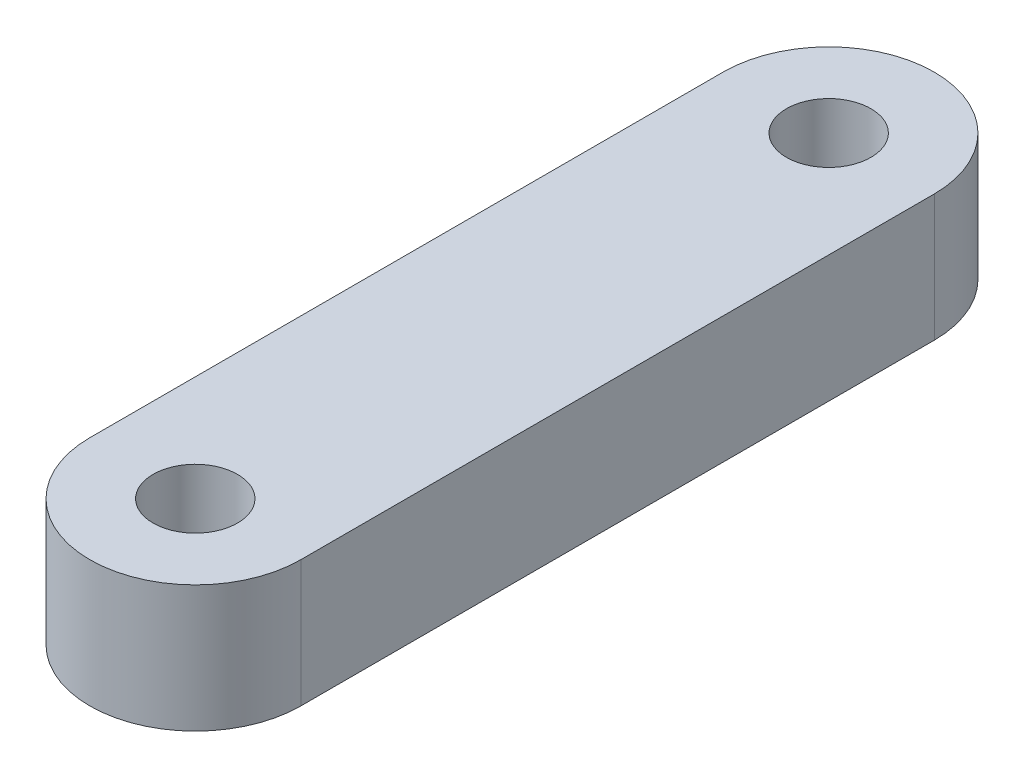
ISO-10303-21;
HEADER;
FILE_DESCRIPTION(('STEP AP214'),'2;1');
FILE_NAME('part.step','',(''),(''),'','','');
FILE_SCHEMA(('AUTOMOTIVE_DESIGN { 1 0 10303 214 1 1 1 1 }'));
ENDSEC;
DATA;
#1=APPLICATION_CONTEXT('core data for automotive mechanical design processes');
#2=APPLICATION_PROTOCOL_DEFINITION('international standard','automotive_design',2000,#1);
#3=PRODUCT_CONTEXT('',#1,'mechanical');
#4=PRODUCT('Part','Part','',(#3));
#5=PRODUCT_RELATED_PRODUCT_CATEGORY('part','',(#4));
#6=PRODUCT_DEFINITION_FORMATION('','',#4);
#7=PRODUCT_DEFINITION_CONTEXT('part definition',#1,'design');
#8=PRODUCT_DEFINITION('design','',#6,#7);
#9=PRODUCT_DEFINITION_SHAPE('','',#8);
#10=(LENGTH_UNIT() NAMED_UNIT(*) SI_UNIT(.MILLI.,.METRE.));
#11=(NAMED_UNIT(*) PLANE_ANGLE_UNIT() SI_UNIT($,.RADIAN.));
#12=(NAMED_UNIT(*) SI_UNIT($,.STERADIAN.) SOLID_ANGLE_UNIT());
#13=UNCERTAINTY_MEASURE_WITH_UNIT(LENGTH_MEASURE(1.E-05),#10,'distance_accuracy_value','');
#14=(GEOMETRIC_REPRESENTATION_CONTEXT(3) GLOBAL_UNCERTAINTY_ASSIGNED_CONTEXT((#13)) GLOBAL_UNIT_ASSIGNED_CONTEXT((#10,
#11,#12)) REPRESENTATION_CONTEXT('',''));
#15=CARTESIAN_POINT('',(0.,0.,0.));
#16=DIRECTION('',(0.,0.,1.));
#17=DIRECTION('',(1.,0.,0.));
#18=AXIS2_PLACEMENT_3D('',#15,#16,#17);
#19=CARTESIAN_POINT('',(0.,-3.,7.5));
#20=DIRECTION('',(0.,1.,0.));
#21=DIRECTION('',(0.,0.,1.));
#22=AXIS2_PLACEMENT_3D('',#19,#20,#21);
#23=CYLINDRICAL_SURFACE('',#22,2.5);
#24=CARTESIAN_POINT('',(0.,0.,7.5));
#25=DIRECTION('',(0.,1.,0.));
#26=DIRECTION('',(0.,0.,1.));
#27=AXIS2_PLACEMENT_3D('',#24,#25,#26);
#28=CIRCLE('',#27,2.5);
#29=CARTESIAN_POINT('',(-2.5,0.,7.5));
#30=VERTEX_POINT('',#29);
#31=CARTESIAN_POINT('',(2.5,0.,7.5));
#32=VERTEX_POINT('',#31);
#33=EDGE_CURVE('E102',#30,#32,#28,.T.);
#34=ORIENTED_EDGE('',*,*,#33,.F.);
#35=DIRECTION('',(0.,1.,0.));
#36=VECTOR('',#35,1.);
#37=CARTESIAN_POINT('',(-2.5,-3.,7.5));
#38=LINE('',#37,#36);
#39=CARTESIAN_POINT('',(-2.5,-3.,7.5));
#40=VERTEX_POINT('',#39);
#41=EDGE_CURVE('E11',#40,#30,#38,.T.);
#42=ORIENTED_EDGE('',*,*,#41,.F.);
#43=CARTESIAN_POINT('',(0.,-3.,7.5));
#44=DIRECTION('',(0.,1.,0.));
#45=DIRECTION('',(0.,0.,1.));
#46=AXIS2_PLACEMENT_3D('',#43,#44,#45);
#47=CIRCLE('',#46,2.5);
#48=CARTESIAN_POINT('',(2.5,-3.,7.5));
#49=VERTEX_POINT('',#48);
#50=EDGE_CURVE('E95',#40,#49,#47,.T.);
#51=ORIENTED_EDGE('',*,*,#50,.T.);
#52=DIRECTION('',(0.,1.,0.));
#53=VECTOR('',#52,1.);
#54=CARTESIAN_POINT('',(2.5,-3.,7.5));
#55=LINE('',#54,#53);
#56=EDGE_CURVE('E40',#49,#32,#55,.T.);
#57=ORIENTED_EDGE('',*,*,#56,.T.);
#58=EDGE_LOOP('',(#34,#42,#51,#57));
#59=FACE_BOUND('',#58,.T.);
#60=ADVANCED_FACE('F37',(#59),#23,.T.);
#61=CARTESIAN_POINT('',(-2.5,-3.,7.5));
#62=DIRECTION('',(-1.,0.,0.));
#63=DIRECTION('',(0.,0.,1.));
#64=AXIS2_PLACEMENT_3D('',#61,#62,#63);
#65=PLANE('',#64);
#66=DIRECTION('',(0.,0.,1.));
#67=VECTOR('',#66,1.);
#68=CARTESIAN_POINT('',(-2.5,0.,7.5));
#69=LINE('',#68,#67);
#70=CARTESIAN_POINT('',(-2.5,0.,-7.5));
#71=VERTEX_POINT('',#70);
#72=EDGE_CURVE('E97',#71,#30,#69,.T.);
#73=ORIENTED_EDGE('',*,*,#72,.F.);
#74=DIRECTION('',(0.,1.,0.));
#75=VECTOR('',#74,1.);
#76=CARTESIAN_POINT('',(-2.5,-3.,-7.5));
#77=LINE('',#76,#75);
#78=CARTESIAN_POINT('',(-2.5,-3.,-7.5));
#79=VERTEX_POINT('',#78);
#80=EDGE_CURVE('E46',#79,#71,#77,.T.);
#81=ORIENTED_EDGE('',*,*,#80,.F.);
#82=DIRECTION('',(0.,0.,1.));
#83=VECTOR('',#82,1.);
#84=CARTESIAN_POINT('',(-2.5,-3.,7.5));
#85=LINE('',#84,#83);
#86=EDGE_CURVE('E92',#79,#40,#85,.T.);
#87=ORIENTED_EDGE('',*,*,#86,.T.);
#88=ORIENTED_EDGE('',*,*,#41,.T.);
#89=EDGE_LOOP('',(#73,#81,#87,#88));
#90=FACE_BOUND('',#89,.T.);
#91=ADVANCED_FACE('F113',(#90),#65,.T.);
#92=CARTESIAN_POINT('',(0.,-3.,-7.5));
#93=DIRECTION('',(0.,1.,0.));
#94=DIRECTION('',(0.,0.,1.));
#95=AXIS2_PLACEMENT_3D('',#92,#93,#94);
#96=CYLINDRICAL_SURFACE('',#95,2.5);
#97=CARTESIAN_POINT('',(0.,0.,-7.5));
#98=DIRECTION('',(0.,1.,0.));
#99=DIRECTION('',(0.,0.,1.));
#100=AXIS2_PLACEMENT_3D('',#97,#98,#99);
#101=CIRCLE('',#100,2.5);
#102=CARTESIAN_POINT('',(2.5,0.,-7.5));
#103=VERTEX_POINT('',#102);
#104=EDGE_CURVE('E87',#103,#71,#101,.T.);
#105=ORIENTED_EDGE('',*,*,#104,.F.);
#106=DIRECTION('',(0.,1.,0.));
#107=VECTOR('',#106,1.);
#108=CARTESIAN_POINT('',(2.5,-3.,-7.5));
#109=LINE('',#108,#107);
#110=CARTESIAN_POINT('',(2.5,-3.,-7.5));
#111=VERTEX_POINT('',#110);
#112=EDGE_CURVE('E82',#111,#103,#109,.T.);
#113=ORIENTED_EDGE('',*,*,#112,.F.);
#114=CARTESIAN_POINT('',(0.,-3.,-7.5));
#115=DIRECTION('',(0.,1.,0.));
#116=DIRECTION('',(0.,0.,1.));
#117=AXIS2_PLACEMENT_3D('',#114,#115,#116);
#118=CIRCLE('',#117,2.5);
#119=EDGE_CURVE('E85',#111,#79,#118,.T.);
#120=ORIENTED_EDGE('',*,*,#119,.T.);
#121=ORIENTED_EDGE('',*,*,#80,.T.);
#122=EDGE_LOOP('',(#105,#113,#120,#121));
#123=FACE_BOUND('',#122,.T.);
#124=ADVANCED_FACE('F84',(#123),#96,.T.);
#125=CARTESIAN_POINT('',(2.5,-3.,7.5));
#126=DIRECTION('',(1.,0.,0.));
#127=DIRECTION('',(0.,0.,-1.));
#128=AXIS2_PLACEMENT_3D('',#125,#126,#127);
#129=PLANE('',#128);
#130=DIRECTION('',(0.,0.,-1.));
#131=VECTOR('',#130,1.);
#132=CARTESIAN_POINT('',(2.5,0.,7.5));
#133=LINE('',#132,#131);
#134=EDGE_CURVE('E105',#32,#103,#133,.T.);
#135=ORIENTED_EDGE('',*,*,#134,.F.);
#136=ORIENTED_EDGE('',*,*,#56,.F.);
#137=DIRECTION('',(0.,0.,-1.));
#138=VECTOR('',#137,1.);
#139=CARTESIAN_POINT('',(2.5,-3.,7.5));
#140=LINE('',#139,#138);
#141=EDGE_CURVE('E91',#49,#111,#140,.T.);
#142=ORIENTED_EDGE('',*,*,#141,.T.);
#143=ORIENTED_EDGE('',*,*,#112,.T.);
#144=EDGE_LOOP('',(#135,#136,#142,#143));
#145=FACE_BOUND('',#144,.T.);
#146=ADVANCED_FACE('F94',(#145),#129,.T.);
#147=CARTESIAN_POINT('',(0.,-3.,7.5));
#148=DIRECTION('',(0.,1.,0.));
#149=DIRECTION('',(0.,0.,1.));
#150=AXIS2_PLACEMENT_3D('',#147,#148,#149);
#151=PLANE('',#150);
#152=CARTESIAN_POINT('',(0.,-3.,7.5));
#153=DIRECTION('',(0.,1.,0.));
#154=DIRECTION('',(0.,0.,1.));
#155=AXIS2_PLACEMENT_3D('',#152,#153,#154);
#156=CIRCLE('',#155,1.);
#157=CARTESIAN_POINT('',(0.,-3.,8.5));
#158=VERTEX_POINT('',#157);
#159=EDGE_CURVE('E146',#158,#158,#156,.T.);
#160=ORIENTED_EDGE('',*,*,#159,.T.);
#161=EDGE_LOOP('',(#160));
#162=FACE_BOUND('',#161,.T.);
#163=CARTESIAN_POINT('',(0.,-3.,-7.5));
#164=DIRECTION('',(0.,1.,0.));
#165=DIRECTION('',(0.,0.,1.));
#166=AXIS2_PLACEMENT_3D('',#163,#164,#165);
#167=CIRCLE('',#166,1.);
#168=CARTESIAN_POINT('',(0.,-3.,-6.5));
#169=VERTEX_POINT('',#168);
#170=EDGE_CURVE('E106',#169,#169,#167,.T.);
#171=ORIENTED_EDGE('',*,*,#170,.T.);
#172=EDGE_LOOP('',(#171));
#173=FACE_BOUND('',#172,.T.);
#174=ORIENTED_EDGE('',*,*,#50,.F.);
#175=ORIENTED_EDGE('',*,*,#86,.F.);
#176=ORIENTED_EDGE('',*,*,#119,.F.);
#177=ORIENTED_EDGE('',*,*,#141,.F.);
#178=EDGE_LOOP('',(#174,#175,#176,#177));
#179=FACE_BOUND('',#178,.T.);
#180=ADVANCED_FACE('F90',(#162,#173,#179),#151,.F.);
#181=CARTESIAN_POINT('',(0.,0.,7.5));
#182=DIRECTION('',(0.,1.,0.));
#183=DIRECTION('',(0.,0.,1.));
#184=AXIS2_PLACEMENT_3D('',#181,#182,#183);
#185=PLANE('',#184);
#186=CARTESIAN_POINT('',(0.,0.,7.5));
#187=DIRECTION('',(0.,1.,0.));
#188=DIRECTION('',(0.,0.,1.));
#189=AXIS2_PLACEMENT_3D('',#186,#187,#188);
#190=CIRCLE('',#189,1.);
#191=CARTESIAN_POINT('',(0.,0.,8.5));
#192=VERTEX_POINT('',#191);
#193=EDGE_CURVE('E149',#192,#192,#190,.T.);
#194=ORIENTED_EDGE('',*,*,#193,.F.);
#195=EDGE_LOOP('',(#194));
#196=FACE_BOUND('',#195,.T.);
#197=CARTESIAN_POINT('',(0.,0.,-7.5));
#198=DIRECTION('',(0.,1.,0.));
#199=DIRECTION('',(0.,0.,1.));
#200=AXIS2_PLACEMENT_3D('',#197,#198,#199);
#201=CIRCLE('',#200,1.);
#202=CARTESIAN_POINT('',(0.,0.,-6.5));
#203=VERTEX_POINT('',#202);
#204=EDGE_CURVE('E151',#203,#203,#201,.T.);
#205=ORIENTED_EDGE('',*,*,#204,.F.);
#206=EDGE_LOOP('',(#205));
#207=FACE_BOUND('',#206,.T.);
#208=ORIENTED_EDGE('',*,*,#33,.T.);
#209=ORIENTED_EDGE('',*,*,#134,.T.);
#210=ORIENTED_EDGE('',*,*,#104,.T.);
#211=ORIENTED_EDGE('',*,*,#72,.T.);
#212=EDGE_LOOP('',(#208,#209,#210,#211));
#213=FACE_BOUND('',#212,.T.);
#214=ADVANCED_FACE('F112',(#196,#207,#213),#185,.T.);
#215=CARTESIAN_POINT('',(0.,-3.,-7.5));
#216=DIRECTION('',(0.,1.,0.));
#217=DIRECTION('',(0.,0.,1.));
#218=AXIS2_PLACEMENT_3D('',#215,#216,#217);
#219=CYLINDRICAL_SURFACE('',#218,1.);
#220=ORIENTED_EDGE('',*,*,#170,.F.);
#221=EDGE_LOOP('',(#220));
#222=FACE_BOUND('',#221,.T.);
#223=ORIENTED_EDGE('',*,*,#204,.T.);
#224=EDGE_LOOP('',(#223));
#225=FACE_BOUND('',#224,.T.);
#226=ADVANCED_FACE('F131',(#222,#225),#219,.F.);
#227=CARTESIAN_POINT('',(0.,-3.,7.5));
#228=DIRECTION('',(0.,1.,0.));
#229=DIRECTION('',(0.,0.,1.));
#230=AXIS2_PLACEMENT_3D('',#227,#228,#229);
#231=CYLINDRICAL_SURFACE('',#230,1.);
#232=ORIENTED_EDGE('',*,*,#159,.F.);
#233=EDGE_LOOP('',(#232));
#234=FACE_BOUND('',#233,.T.);
#235=ORIENTED_EDGE('',*,*,#193,.T.);
#236=EDGE_LOOP('',(#235));
#237=FACE_BOUND('',#236,.T.);
#238=ADVANCED_FACE('F138',(#234,#237),#231,.F.);
#239=CLOSED_SHELL('',(#60,#91,#124,#146,#180,#214,#226,#238));
#240=MANIFOLD_SOLID_BREP('B2',#239);
#241=ADVANCED_BREP_SHAPE_REPRESENTATION('',(#18,#240),#14);
#242=SHAPE_DEFINITION_REPRESENTATION(#9,#241);
ENDSEC;
END-ISO-10303-21;
